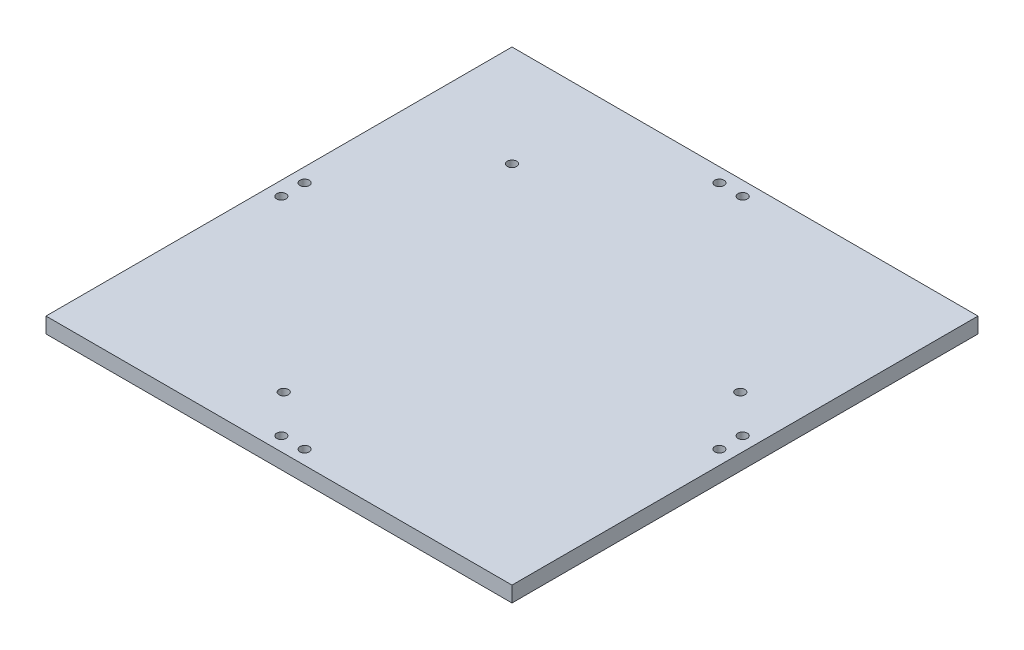
ISO-10303-21;
HEADER;
FILE_DESCRIPTION(('STEP AP214'),'2;1');
FILE_NAME('part.step','',(''),(''),'','','');
FILE_SCHEMA(('AUTOMOTIVE_DESIGN { 1 0 10303 214 1 1 1 1 }'));
ENDSEC;
DATA;
#1=APPLICATION_CONTEXT('core data for automotive mechanical design processes');
#2=APPLICATION_PROTOCOL_DEFINITION('international standard','automotive_design',2000,#1);
#3=PRODUCT_CONTEXT('',#1,'mechanical');
#4=PRODUCT('Part','Part','',(#3));
#5=PRODUCT_RELATED_PRODUCT_CATEGORY('part','',(#4));
#6=PRODUCT_DEFINITION_FORMATION('','',#4);
#7=PRODUCT_DEFINITION_CONTEXT('part definition',#1,'design');
#8=PRODUCT_DEFINITION('design','',#6,#7);
#9=PRODUCT_DEFINITION_SHAPE('','',#8);
#10=(LENGTH_UNIT() NAMED_UNIT(*) SI_UNIT(.MILLI.,.METRE.));
#11=(NAMED_UNIT(*) PLANE_ANGLE_UNIT() SI_UNIT($,.RADIAN.));
#12=(NAMED_UNIT(*) SI_UNIT($,.STERADIAN.) SOLID_ANGLE_UNIT());
#13=UNCERTAINTY_MEASURE_WITH_UNIT(LENGTH_MEASURE(1.E-05),#10,'distance_accuracy_value','');
#14=(GEOMETRIC_REPRESENTATION_CONTEXT(3) GLOBAL_UNCERTAINTY_ASSIGNED_CONTEXT((#13)) GLOBAL_UNIT_ASSIGNED_CONTEXT((#10,
#11,#12)) REPRESENTATION_CONTEXT('',''));
#15=CARTESIAN_POINT('',(0.,0.,0.));
#16=DIRECTION('',(0.,0.,1.));
#17=DIRECTION('',(1.,0.,0.));
#18=AXIS2_PLACEMENT_3D('',#15,#16,#17);
#19=CARTESIAN_POINT('',(0.,10.,0.));
#20=DIRECTION('',(0.,1.,0.));
#21=DIRECTION('',(0.,0.,1.));
#22=AXIS2_PLACEMENT_3D('',#19,#20,#21);
#23=PLANE('',#22);
#24=CARTESIAN_POINT('',(-84.8528137423865,10.,-84.8528137423853));
#25=DIRECTION('',(0.,1.,0.));
#26=DIRECTION('',(0.,0.,1.));
#27=AXIS2_PLACEMENT_3D('',#24,#25,#26);
#28=CIRCLE('',#27,3.00000000000001);
#29=CARTESIAN_POINT('',(-84.8528137423865,10.,-81.8528137423853));
#30=VERTEX_POINT('',#29);
#31=EDGE_CURVE('E112',#30,#30,#28,.T.);
#32=ORIENTED_EDGE('',*,*,#31,.F.);
#33=EDGE_LOOP('',(#32));
#34=FACE_BOUND('',#33,.T.);
#35=CARTESIAN_POINT('',(115.911099154689,10.,-31.0582854123031));
#36=DIRECTION('',(0.,1.,0.));
#37=DIRECTION('',(0.,0.,1.));
#38=AXIS2_PLACEMENT_3D('',#35,#36,#37);
#39=CIRCLE('',#38,3.00000000000001);
#40=CARTESIAN_POINT('',(115.911099154689,10.,-28.0582854123031));
#41=VERTEX_POINT('',#40);
#42=EDGE_CURVE('E369',#41,#41,#39,.T.);
#43=ORIENTED_EDGE('',*,*,#42,.F.);
#44=EDGE_LOOP('',(#43));
#45=FACE_BOUND('',#44,.T.);
#46=CARTESIAN_POINT('',(-31.0582854123021,10.,115.911099154688));
#47=DIRECTION('',(0.,1.,0.));
#48=DIRECTION('',(0.,0.,1.));
#49=AXIS2_PLACEMENT_3D('',#46,#47,#48);
#50=CIRCLE('',#49,3.);
#51=CARTESIAN_POINT('',(-31.0582854123021,10.,118.911099154688));
#52=VERTEX_POINT('',#51);
#53=EDGE_CURVE('E372',#52,#52,#50,.T.);
#54=ORIENTED_EDGE('',*,*,#53,.F.);
#55=EDGE_LOOP('',(#54));
#56=FACE_BOUND('',#55,.T.);
#57=CARTESIAN_POINT('',(-7.50000000000149,10.,141.));
#58=DIRECTION('',(0.,1.,0.));
#59=DIRECTION('',(0.,0.,1.));
#60=AXIS2_PLACEMENT_3D('',#57,#58,#59);
#61=CIRCLE('',#60,3.);
#62=CARTESIAN_POINT('',(-7.50000000000149,10.,144.));
#63=VERTEX_POINT('',#62);
#64=EDGE_CURVE('E130',#63,#63,#61,.T.);
#65=ORIENTED_EDGE('',*,*,#64,.F.);
#66=EDGE_LOOP('',(#65));
#67=FACE_BOUND('',#66,.T.);
#68=CARTESIAN_POINT('',(141.,10.,7.500000000001));
#69=DIRECTION('',(0.,1.,0.));
#70=DIRECTION('',(0.,0.,1.));
#71=AXIS2_PLACEMENT_3D('',#68,#69,#70);
#72=CIRCLE('',#71,2.99999999999999);
#73=CARTESIAN_POINT('',(141.,10.,10.500000000001));
#74=VERTEX_POINT('',#73);
#75=EDGE_CURVE('E142',#74,#74,#72,.T.);
#76=ORIENTED_EDGE('',*,*,#75,.F.);
#77=EDGE_LOOP('',(#76));
#78=FACE_BOUND('',#77,.T.);
#79=CARTESIAN_POINT('',(7.50000000000051,10.,-141.));
#80=DIRECTION('',(0.,1.,0.));
#81=DIRECTION('',(0.,0.,1.));
#82=AXIS2_PLACEMENT_3D('',#79,#80,#81);
#83=CIRCLE('',#82,3.);
#84=CARTESIAN_POINT('',(7.50000000000051,10.,-138.));
#85=VERTEX_POINT('',#84);
#86=EDGE_CURVE('E154',#85,#85,#83,.T.);
#87=ORIENTED_EDGE('',*,*,#86,.F.);
#88=EDGE_LOOP('',(#87));
#89=FACE_BOUND('',#88,.T.);
#90=CARTESIAN_POINT('',(-141.,10.,-7.50000000000001));
#91=DIRECTION('',(0.,1.,0.));
#92=DIRECTION('',(0.,0.,1.));
#93=AXIS2_PLACEMENT_3D('',#90,#91,#92);
#94=CIRCLE('',#93,2.99999999999999);
#95=CARTESIAN_POINT('',(-141.,10.,-4.50000000000002));
#96=VERTEX_POINT('',#95);
#97=EDGE_CURVE('E103',#96,#96,#94,.T.);
#98=ORIENTED_EDGE('',*,*,#97,.F.);
#99=EDGE_LOOP('',(#98));
#100=FACE_BOUND('',#99,.T.);
#101=DIRECTION('',(0.,0.,1.));
#102=VECTOR('',#101,1.);
#103=CARTESIAN_POINT('',(-150.,10.,150.));
#104=LINE('',#103,#102);
#105=CARTESIAN_POINT('',(-150.,10.,-150.));
#106=VERTEX_POINT('',#105);
#107=CARTESIAN_POINT('',(-150.,10.,150.));
#108=VERTEX_POINT('',#107);
#109=EDGE_CURVE('E87',#106,#108,#104,.T.);
#110=ORIENTED_EDGE('',*,*,#109,.T.);
#111=DIRECTION('',(1.,0.,0.));
#112=VECTOR('',#111,1.);
#113=CARTESIAN_POINT('',(150.,10.,150.));
#114=LINE('',#113,#112);
#115=CARTESIAN_POINT('',(150.,10.,150.));
#116=VERTEX_POINT('',#115);
#117=EDGE_CURVE('E82',#108,#116,#114,.T.);
#118=ORIENTED_EDGE('',*,*,#117,.T.);
#119=DIRECTION('',(0.,0.,-1.));
#120=VECTOR('',#119,1.);
#121=CARTESIAN_POINT('',(150.,10.,150.));
#122=LINE('',#121,#120);
#123=CARTESIAN_POINT('',(150.,10.,-150.));
#124=VERTEX_POINT('',#123);
#125=EDGE_CURVE('E85',#116,#124,#122,.T.);
#126=ORIENTED_EDGE('',*,*,#125,.T.);
#127=DIRECTION('',(-1.,0.,0.));
#128=VECTOR('',#127,1.);
#129=CARTESIAN_POINT('',(150.,10.,-150.));
#130=LINE('',#129,#128);
#131=EDGE_CURVE('E52',#124,#106,#130,.T.);
#132=ORIENTED_EDGE('',*,*,#131,.T.);
#133=EDGE_LOOP('',(#110,#118,#126,#132));
#134=FACE_BOUND('',#133,.T.);
#135=CARTESIAN_POINT('',(-141.,10.,7.49999999999999));
#136=DIRECTION('',(0.,1.,0.));
#137=DIRECTION('',(0.,0.,1.));
#138=AXIS2_PLACEMENT_3D('',#135,#136,#137);
#139=CIRCLE('',#138,2.99999999999999);
#140=CARTESIAN_POINT('',(-141.,10.,10.5));
#141=VERTEX_POINT('',#140);
#142=EDGE_CURVE('E160',#141,#141,#139,.T.);
#143=ORIENTED_EDGE('',*,*,#142,.F.);
#144=EDGE_LOOP('',(#143));
#145=FACE_BOUND('',#144,.T.);
#146=CARTESIAN_POINT('',(-7.49999999999949,10.,-141.));
#147=DIRECTION('',(0.,1.,0.));
#148=DIRECTION('',(0.,0.,1.));
#149=AXIS2_PLACEMENT_3D('',#146,#147,#148);
#150=CIRCLE('',#149,3.);
#151=CARTESIAN_POINT('',(-7.49999999999949,10.,-138.));
#152=VERTEX_POINT('',#151);
#153=EDGE_CURVE('E148',#152,#152,#150,.T.);
#154=ORIENTED_EDGE('',*,*,#153,.F.);
#155=EDGE_LOOP('',(#154));
#156=FACE_BOUND('',#155,.T.);
#157=CARTESIAN_POINT('',(141.,10.,-7.499999999999));
#158=DIRECTION('',(0.,1.,0.));
#159=DIRECTION('',(0.,0.,1.));
#160=AXIS2_PLACEMENT_3D('',#157,#158,#159);
#161=CIRCLE('',#160,2.99999999999999);
#162=CARTESIAN_POINT('',(141.,10.,-4.49999999999901));
#163=VERTEX_POINT('',#162);
#164=EDGE_CURVE('E136',#163,#163,#161,.T.);
#165=ORIENTED_EDGE('',*,*,#164,.F.);
#166=EDGE_LOOP('',(#165));
#167=FACE_BOUND('',#166,.T.);
#168=CARTESIAN_POINT('',(7.49999999999851,10.,141.));
#169=DIRECTION('',(0.,1.,0.));
#170=DIRECTION('',(0.,0.,1.));
#171=AXIS2_PLACEMENT_3D('',#168,#169,#170);
#172=CIRCLE('',#171,3.);
#173=CARTESIAN_POINT('',(7.49999999999851,10.,144.));
#174=VERTEX_POINT('',#173);
#175=EDGE_CURVE('E121',#174,#174,#172,.T.);
#176=ORIENTED_EDGE('',*,*,#175,.F.);
#177=EDGE_LOOP('',(#176));
#178=FACE_BOUND('',#177,.T.);
#179=ADVANCED_FACE('F33',(#34,#45,#56,#67,#78,#89,#100,#134,#145,#156,#167,#178),#23,.T.);
#180=CARTESIAN_POINT('',(0.,0.,0.));
#181=DIRECTION('',(0.,1.,0.));
#182=DIRECTION('',(0.,0.,1.));
#183=AXIS2_PLACEMENT_3D('',#180,#181,#182);
#184=PLANE('',#183);
#185=CARTESIAN_POINT('',(-84.8528137423865,0.,-84.8528137423853));
#186=DIRECTION('',(0.,1.,0.));
#187=DIRECTION('',(0.,0.,1.));
#188=AXIS2_PLACEMENT_3D('',#185,#186,#187);
#189=CIRCLE('',#188,3.00000000000001);
#190=CARTESIAN_POINT('',(-84.8528137423865,0.,-81.8528137423853));
#191=VERTEX_POINT('',#190);
#192=EDGE_CURVE('E37',#191,#191,#189,.T.);
#193=ORIENTED_EDGE('',*,*,#192,.T.);
#194=EDGE_LOOP('',(#193));
#195=FACE_BOUND('',#194,.T.);
#196=CARTESIAN_POINT('',(115.911099154689,0.,-31.0582854123031));
#197=DIRECTION('',(0.,1.,0.));
#198=DIRECTION('',(0.,0.,1.));
#199=AXIS2_PLACEMENT_3D('',#196,#197,#198);
#200=CIRCLE('',#199,3.00000000000001);
#201=CARTESIAN_POINT('',(115.911099154689,0.,-28.0582854123031));
#202=VERTEX_POINT('',#201);
#203=EDGE_CURVE('E111',#202,#202,#200,.T.);
#204=ORIENTED_EDGE('',*,*,#203,.T.);
#205=EDGE_LOOP('',(#204));
#206=FACE_BOUND('',#205,.T.);
#207=CARTESIAN_POINT('',(-31.0582854123021,0.,115.911099154688));
#208=DIRECTION('',(0.,1.,0.));
#209=DIRECTION('',(0.,0.,1.));
#210=AXIS2_PLACEMENT_3D('',#207,#208,#209);
#211=CIRCLE('',#210,3.);
#212=CARTESIAN_POINT('',(-31.0582854123021,0.,118.911099154688));
#213=VERTEX_POINT('',#212);
#214=EDGE_CURVE('E109',#213,#213,#211,.T.);
#215=ORIENTED_EDGE('',*,*,#214,.T.);
#216=EDGE_LOOP('',(#215));
#217=FACE_BOUND('',#216,.T.);
#218=DIRECTION('',(0.,0.,1.));
#219=VECTOR('',#218,1.);
#220=CARTESIAN_POINT('',(-150.,0.,150.));
#221=LINE('',#220,#219);
#222=CARTESIAN_POINT('',(-150.,0.,-150.));
#223=VERTEX_POINT('',#222);
#224=CARTESIAN_POINT('',(-150.,0.,150.));
#225=VERTEX_POINT('',#224);
#226=EDGE_CURVE('E100',#223,#225,#221,.T.);
#227=ORIENTED_EDGE('',*,*,#226,.F.);
#228=DIRECTION('',(-1.,0.,0.));
#229=VECTOR('',#228,1.);
#230=CARTESIAN_POINT('',(150.,0.,-150.));
#231=LINE('',#230,#229);
#232=CARTESIAN_POINT('',(150.,0.,-150.));
#233=VERTEX_POINT('',#232);
#234=EDGE_CURVE('E75',#233,#223,#231,.T.);
#235=ORIENTED_EDGE('',*,*,#234,.F.);
#236=DIRECTION('',(0.,0.,-1.));
#237=VECTOR('',#236,1.);
#238=CARTESIAN_POINT('',(150.,0.,150.));
#239=LINE('',#238,#237);
#240=CARTESIAN_POINT('',(150.,0.,150.));
#241=VERTEX_POINT('',#240);
#242=EDGE_CURVE('E69',#241,#233,#239,.T.);
#243=ORIENTED_EDGE('',*,*,#242,.F.);
#244=DIRECTION('',(1.,0.,0.));
#245=VECTOR('',#244,1.);
#246=CARTESIAN_POINT('',(150.,0.,150.));
#247=LINE('',#246,#245);
#248=EDGE_CURVE('E91',#225,#241,#247,.T.);
#249=ORIENTED_EDGE('',*,*,#248,.F.);
#250=EDGE_LOOP('',(#227,#235,#243,#249));
#251=FACE_BOUND('',#250,.T.);
#252=CARTESIAN_POINT('',(-141.,0.,-7.50000000000001));
#253=DIRECTION('',(0.,1.,0.));
#254=DIRECTION('',(0.,0.,1.));
#255=AXIS2_PLACEMENT_3D('',#252,#253,#254);
#256=CIRCLE('',#255,2.99999999999999);
#257=CARTESIAN_POINT('',(-141.,0.,-4.50000000000002));
#258=VERTEX_POINT('',#257);
#259=EDGE_CURVE('E163',#258,#258,#256,.T.);
#260=ORIENTED_EDGE('',*,*,#259,.T.);
#261=EDGE_LOOP('',(#260));
#262=FACE_BOUND('',#261,.T.);
#263=CARTESIAN_POINT('',(-141.,0.,7.49999999999999));
#264=DIRECTION('',(0.,1.,0.));
#265=DIRECTION('',(0.,0.,1.));
#266=AXIS2_PLACEMENT_3D('',#263,#264,#265);
#267=CIRCLE('',#266,2.99999999999999);
#268=CARTESIAN_POINT('',(-141.,0.,10.5));
#269=VERTEX_POINT('',#268);
#270=EDGE_CURVE('E157',#269,#269,#267,.T.);
#271=ORIENTED_EDGE('',*,*,#270,.T.);
#272=EDGE_LOOP('',(#271));
#273=FACE_BOUND('',#272,.T.);
#274=CARTESIAN_POINT('',(7.50000000000051,0.,-141.));
#275=DIRECTION('',(0.,1.,0.));
#276=DIRECTION('',(0.,0.,1.));
#277=AXIS2_PLACEMENT_3D('',#274,#275,#276);
#278=CIRCLE('',#277,3.);
#279=CARTESIAN_POINT('',(7.50000000000051,0.,-138.));
#280=VERTEX_POINT('',#279);
#281=EDGE_CURVE('E151',#280,#280,#278,.T.);
#282=ORIENTED_EDGE('',*,*,#281,.T.);
#283=EDGE_LOOP('',(#282));
#284=FACE_BOUND('',#283,.T.);
#285=CARTESIAN_POINT('',(-7.49999999999949,0.,-141.));
#286=DIRECTION('',(0.,1.,0.));
#287=DIRECTION('',(0.,0.,1.));
#288=AXIS2_PLACEMENT_3D('',#285,#286,#287);
#289=CIRCLE('',#288,3.);
#290=CARTESIAN_POINT('',(-7.49999999999949,0.,-138.));
#291=VERTEX_POINT('',#290);
#292=EDGE_CURVE('E145',#291,#291,#289,.T.);
#293=ORIENTED_EDGE('',*,*,#292,.T.);
#294=EDGE_LOOP('',(#293));
#295=FACE_BOUND('',#294,.T.);
#296=CARTESIAN_POINT('',(141.,0.,7.500000000001));
#297=DIRECTION('',(0.,1.,0.));
#298=DIRECTION('',(0.,0.,1.));
#299=AXIS2_PLACEMENT_3D('',#296,#297,#298);
#300=CIRCLE('',#299,2.99999999999999);
#301=CARTESIAN_POINT('',(141.,0.,10.500000000001));
#302=VERTEX_POINT('',#301);
#303=EDGE_CURVE('E139',#302,#302,#300,.T.);
#304=ORIENTED_EDGE('',*,*,#303,.T.);
#305=EDGE_LOOP('',(#304));
#306=FACE_BOUND('',#305,.T.);
#307=CARTESIAN_POINT('',(141.,0.,-7.499999999999));
#308=DIRECTION('',(0.,1.,0.));
#309=DIRECTION('',(0.,0.,1.));
#310=AXIS2_PLACEMENT_3D('',#307,#308,#309);
#311=CIRCLE('',#310,2.99999999999999);
#312=CARTESIAN_POINT('',(141.,0.,-4.49999999999901));
#313=VERTEX_POINT('',#312);
#314=EDGE_CURVE('E133',#313,#313,#311,.T.);
#315=ORIENTED_EDGE('',*,*,#314,.T.);
#316=EDGE_LOOP('',(#315));
#317=FACE_BOUND('',#316,.T.);
#318=CARTESIAN_POINT('',(-7.50000000000149,0.,141.));
#319=DIRECTION('',(0.,1.,0.));
#320=DIRECTION('',(0.,0.,1.));
#321=AXIS2_PLACEMENT_3D('',#318,#319,#320);
#322=CIRCLE('',#321,3.);
#323=CARTESIAN_POINT('',(-7.50000000000149,0.,144.));
#324=VERTEX_POINT('',#323);
#325=EDGE_CURVE('E126',#324,#324,#322,.T.);
#326=ORIENTED_EDGE('',*,*,#325,.T.);
#327=EDGE_LOOP('',(#326));
#328=FACE_BOUND('',#327,.T.);
#329=CARTESIAN_POINT('',(7.49999999999851,0.,141.));
#330=DIRECTION('',(0.,1.,0.));
#331=DIRECTION('',(0.,0.,1.));
#332=AXIS2_PLACEMENT_3D('',#329,#330,#331);
#333=CIRCLE('',#332,3.);
#334=CARTESIAN_POINT('',(7.49999999999851,0.,144.));
#335=VERTEX_POINT('',#334);
#336=EDGE_CURVE('E117',#335,#335,#333,.T.);
#337=ORIENTED_EDGE('',*,*,#336,.T.);
#338=EDGE_LOOP('',(#337));
#339=FACE_BOUND('',#338,.T.);
#340=ADVANCED_FACE('F171',(#195,#206,#217,#251,#262,#273,#284,#295,#306,#317,#328,#339),#184,.F.);
#341=CARTESIAN_POINT('',(-150.,10.,150.));
#342=DIRECTION('',(1.,0.,0.));
#343=DIRECTION('',(0.,0.,-1.));
#344=AXIS2_PLACEMENT_3D('',#341,#342,#343);
#345=PLANE('',#344);
#346=ORIENTED_EDGE('',*,*,#226,.T.);
#347=DIRECTION('',(0.,-1.,0.));
#348=VECTOR('',#347,1.);
#349=CARTESIAN_POINT('',(-150.,10.,150.));
#350=LINE('',#349,#348);
#351=EDGE_CURVE('E11',#108,#225,#350,.T.);
#352=ORIENTED_EDGE('',*,*,#351,.F.);
#353=ORIENTED_EDGE('',*,*,#109,.F.);
#354=DIRECTION('',(0.,-1.,0.));
#355=VECTOR('',#354,1.);
#356=CARTESIAN_POINT('',(-150.,10.,-150.));
#357=LINE('',#356,#355);
#358=EDGE_CURVE('E96',#106,#223,#357,.T.);
#359=ORIENTED_EDGE('',*,*,#358,.T.);
#360=EDGE_LOOP('',(#346,#352,#353,#359));
#361=FACE_BOUND('',#360,.T.);
#362=ADVANCED_FACE('F35',(#361),#345,.F.);
#363=CARTESIAN_POINT('',(150.,10.,150.));
#364=DIRECTION('',(0.,0.,-1.));
#365=DIRECTION('',(-1.,0.,0.));
#366=AXIS2_PLACEMENT_3D('',#363,#364,#365);
#367=PLANE('',#366);
#368=ORIENTED_EDGE('',*,*,#248,.T.);
#369=DIRECTION('',(0.,-1.,0.));
#370=VECTOR('',#369,1.);
#371=CARTESIAN_POINT('',(150.,10.,150.));
#372=LINE('',#371,#370);
#373=EDGE_CURVE('E43',#116,#241,#372,.T.);
#374=ORIENTED_EDGE('',*,*,#373,.F.);
#375=ORIENTED_EDGE('',*,*,#117,.F.);
#376=ORIENTED_EDGE('',*,*,#351,.T.);
#377=EDGE_LOOP('',(#368,#374,#375,#376));
#378=FACE_BOUND('',#377,.T.);
#379=ADVANCED_FACE('F90',(#378),#367,.F.);
#380=CARTESIAN_POINT('',(150.,10.,150.));
#381=DIRECTION('',(-1.,0.,0.));
#382=DIRECTION('',(0.,0.,1.));
#383=AXIS2_PLACEMENT_3D('',#380,#381,#382);
#384=PLANE('',#383);
#385=ORIENTED_EDGE('',*,*,#242,.T.);
#386=DIRECTION('',(0.,-1.,0.));
#387=VECTOR('',#386,1.);
#388=CARTESIAN_POINT('',(150.,10.,-150.));
#389=LINE('',#388,#387);
#390=EDGE_CURVE('E92',#124,#233,#389,.T.);
#391=ORIENTED_EDGE('',*,*,#390,.F.);
#392=ORIENTED_EDGE('',*,*,#125,.F.);
#393=ORIENTED_EDGE('',*,*,#373,.T.);
#394=EDGE_LOOP('',(#385,#391,#392,#393));
#395=FACE_BOUND('',#394,.T.);
#396=ADVANCED_FACE('F94',(#395),#384,.F.);
#397=CARTESIAN_POINT('',(150.,10.,-150.));
#398=DIRECTION('',(0.,0.,1.));
#399=DIRECTION('',(1.,0.,0.));
#400=AXIS2_PLACEMENT_3D('',#397,#398,#399);
#401=PLANE('',#400);
#402=ORIENTED_EDGE('',*,*,#234,.T.);
#403=ORIENTED_EDGE('',*,*,#358,.F.);
#404=ORIENTED_EDGE('',*,*,#131,.F.);
#405=ORIENTED_EDGE('',*,*,#390,.T.);
#406=EDGE_LOOP('',(#402,#403,#404,#405));
#407=FACE_BOUND('',#406,.T.);
#408=ADVANCED_FACE('F177',(#407),#401,.F.);
#409=CARTESIAN_POINT('',(-141.,10.,-7.50000000000001));
#410=DIRECTION('',(0.,-1.,0.));
#411=DIRECTION('',(0.,0.,-1.));
#412=AXIS2_PLACEMENT_3D('',#409,#410,#411);
#413=CYLINDRICAL_SURFACE('',#412,2.99999999999999);
#414=ORIENTED_EDGE('',*,*,#97,.T.);
#415=EDGE_LOOP('',(#414));
#416=FACE_BOUND('',#415,.T.);
#417=ORIENTED_EDGE('',*,*,#259,.F.);
#418=EDGE_LOOP('',(#417));
#419=FACE_BOUND('',#418,.T.);
#420=ADVANCED_FACE('F174',(#416,#419),#413,.F.);
#421=CARTESIAN_POINT('',(-141.,10.,7.49999999999999));
#422=DIRECTION('',(0.,-1.,0.));
#423=DIRECTION('',(0.,0.,-1.));
#424=AXIS2_PLACEMENT_3D('',#421,#422,#423);
#425=CYLINDRICAL_SURFACE('',#424,2.99999999999999);
#426=ORIENTED_EDGE('',*,*,#142,.T.);
#427=EDGE_LOOP('',(#426));
#428=FACE_BOUND('',#427,.T.);
#429=ORIENTED_EDGE('',*,*,#270,.F.);
#430=EDGE_LOOP('',(#429));
#431=FACE_BOUND('',#430,.T.);
#432=ADVANCED_FACE('F176',(#428,#431),#425,.F.);
#433=CARTESIAN_POINT('',(7.50000000000051,10.,-141.));
#434=DIRECTION('',(0.,-1.,0.));
#435=DIRECTION('',(0.,0.,-1.));
#436=AXIS2_PLACEMENT_3D('',#433,#434,#435);
#437=CYLINDRICAL_SURFACE('',#436,3.);
#438=ORIENTED_EDGE('',*,*,#86,.T.);
#439=EDGE_LOOP('',(#438));
#440=FACE_BOUND('',#439,.T.);
#441=ORIENTED_EDGE('',*,*,#281,.F.);
#442=EDGE_LOOP('',(#441));
#443=FACE_BOUND('',#442,.T.);
#444=ADVANCED_FACE('F184',(#440,#443),#437,.F.);
#445=CARTESIAN_POINT('',(-7.49999999999949,10.,-141.));
#446=DIRECTION('',(0.,-1.,0.));
#447=DIRECTION('',(0.,0.,-1.));
#448=AXIS2_PLACEMENT_3D('',#445,#446,#447);
#449=CYLINDRICAL_SURFACE('',#448,3.);
#450=ORIENTED_EDGE('',*,*,#153,.T.);
#451=EDGE_LOOP('',(#450));
#452=FACE_BOUND('',#451,.T.);
#453=ORIENTED_EDGE('',*,*,#292,.F.);
#454=EDGE_LOOP('',(#453));
#455=FACE_BOUND('',#454,.T.);
#456=ADVANCED_FACE('F270',(#452,#455),#449,.F.);
#457=CARTESIAN_POINT('',(141.,10.,7.500000000001));
#458=DIRECTION('',(0.,-1.,0.));
#459=DIRECTION('',(0.,0.,-1.));
#460=AXIS2_PLACEMENT_3D('',#457,#458,#459);
#461=CYLINDRICAL_SURFACE('',#460,2.99999999999999);
#462=ORIENTED_EDGE('',*,*,#75,.T.);
#463=EDGE_LOOP('',(#462));
#464=FACE_BOUND('',#463,.T.);
#465=ORIENTED_EDGE('',*,*,#303,.F.);
#466=EDGE_LOOP('',(#465));
#467=FACE_BOUND('',#466,.T.);
#468=ADVANCED_FACE('F266',(#464,#467),#461,.F.);
#469=CARTESIAN_POINT('',(141.,10.,-7.499999999999));
#470=DIRECTION('',(0.,-1.,0.));
#471=DIRECTION('',(0.,0.,-1.));
#472=AXIS2_PLACEMENT_3D('',#469,#470,#471);
#473=CYLINDRICAL_SURFACE('',#472,2.99999999999999);
#474=ORIENTED_EDGE('',*,*,#164,.T.);
#475=EDGE_LOOP('',(#474));
#476=FACE_BOUND('',#475,.T.);
#477=ORIENTED_EDGE('',*,*,#314,.F.);
#478=EDGE_LOOP('',(#477));
#479=FACE_BOUND('',#478,.T.);
#480=ADVANCED_FACE('F262',(#476,#479),#473,.F.);
#481=CARTESIAN_POINT('',(-7.50000000000149,10.,141.));
#482=DIRECTION('',(0.,-1.,0.));
#483=DIRECTION('',(0.,0.,-1.));
#484=AXIS2_PLACEMENT_3D('',#481,#482,#483);
#485=CYLINDRICAL_SURFACE('',#484,3.);
#486=ORIENTED_EDGE('',*,*,#64,.T.);
#487=EDGE_LOOP('',(#486));
#488=FACE_BOUND('',#487,.T.);
#489=ORIENTED_EDGE('',*,*,#325,.F.);
#490=EDGE_LOOP('',(#489));
#491=FACE_BOUND('',#490,.T.);
#492=ADVANCED_FACE('F258',(#488,#491),#485,.F.);
#493=CARTESIAN_POINT('',(7.49999999999851,10.,141.));
#494=DIRECTION('',(0.,-1.,0.));
#495=DIRECTION('',(0.,0.,-1.));
#496=AXIS2_PLACEMENT_3D('',#493,#494,#495);
#497=CYLINDRICAL_SURFACE('',#496,3.);
#498=ORIENTED_EDGE('',*,*,#175,.T.);
#499=EDGE_LOOP('',(#498));
#500=FACE_BOUND('',#499,.T.);
#501=ORIENTED_EDGE('',*,*,#336,.F.);
#502=EDGE_LOOP('',(#501));
#503=FACE_BOUND('',#502,.T.);
#504=ADVANCED_FACE('F228',(#500,#503),#497,.F.);
#505=CARTESIAN_POINT('',(-31.0582854123021,-20.,115.911099154688));
#506=DIRECTION('',(0.,1.,0.));
#507=DIRECTION('',(0.,0.,1.));
#508=AXIS2_PLACEMENT_3D('',#505,#506,#507);
#509=CYLINDRICAL_SURFACE('',#508,3.);
#510=ORIENTED_EDGE('',*,*,#53,.T.);
#511=EDGE_LOOP('',(#510));
#512=FACE_BOUND('',#511,.T.);
#513=ORIENTED_EDGE('',*,*,#214,.F.);
#514=EDGE_LOOP('',(#513));
#515=FACE_BOUND('',#514,.T.);
#516=ADVANCED_FACE('F222',(#512,#515),#509,.F.);
#517=CARTESIAN_POINT('',(115.911099154689,-20.,-31.0582854123031));
#518=DIRECTION('',(0.,1.,0.));
#519=DIRECTION('',(0.,0.,1.));
#520=AXIS2_PLACEMENT_3D('',#517,#518,#519);
#521=CYLINDRICAL_SURFACE('',#520,3.00000000000001);
#522=ORIENTED_EDGE('',*,*,#42,.T.);
#523=EDGE_LOOP('',(#522));
#524=FACE_BOUND('',#523,.T.);
#525=ORIENTED_EDGE('',*,*,#203,.F.);
#526=EDGE_LOOP('',(#525));
#527=FACE_BOUND('',#526,.T.);
#528=ADVANCED_FACE('F227',(#524,#527),#521,.F.);
#529=CARTESIAN_POINT('',(-84.8528137423865,-20.,-84.8528137423853));
#530=DIRECTION('',(0.,1.,0.));
#531=DIRECTION('',(0.,0.,1.));
#532=AXIS2_PLACEMENT_3D('',#529,#530,#531);
#533=CYLINDRICAL_SURFACE('',#532,3.00000000000001);
#534=ORIENTED_EDGE('',*,*,#31,.T.);
#535=EDGE_LOOP('',(#534));
#536=FACE_BOUND('',#535,.T.);
#537=ORIENTED_EDGE('',*,*,#192,.F.);
#538=EDGE_LOOP('',(#537));
#539=FACE_BOUND('',#538,.T.);
#540=ADVANCED_FACE('F240',(#536,#539),#533,.F.);
#541=CLOSED_SHELL('',(#179,#340,#362,#379,#396,#408,#420,#432,#444,#456,#468,#480,#492,#504,
#516,#528,#540));
#542=MANIFOLD_SOLID_BREP('B2',#541);
#543=ADVANCED_BREP_SHAPE_REPRESENTATION('',(#18,#542),#14);
#544=SHAPE_DEFINITION_REPRESENTATION(#9,#543);
ENDSEC;
END-ISO-10303-21;
